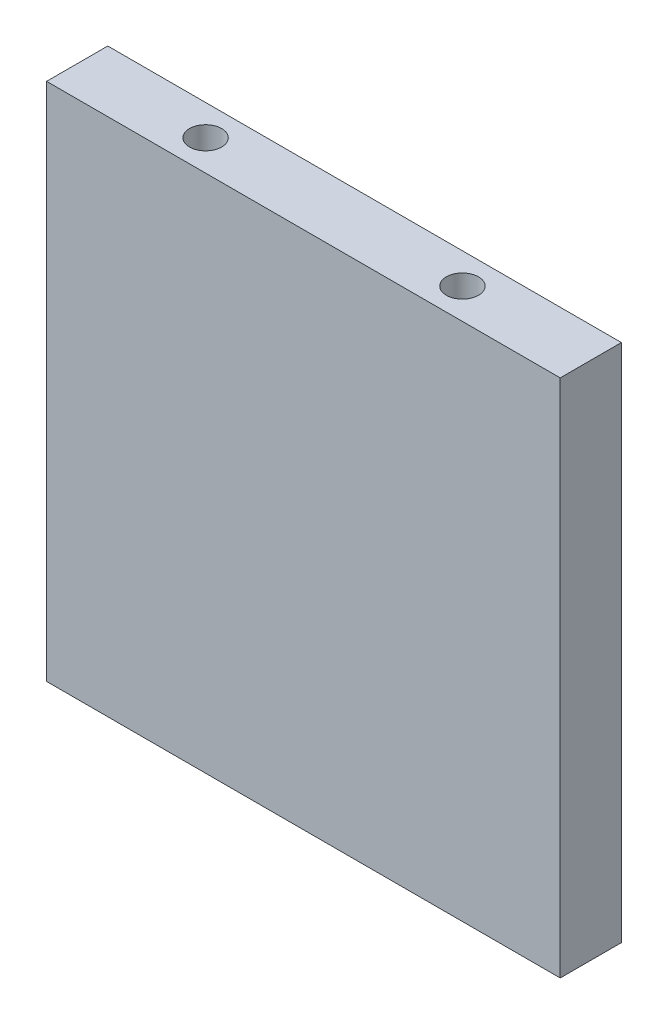
ISO-10303-21;
HEADER;
FILE_DESCRIPTION(('STEP AP214'),'2;1');
FILE_NAME('part.step','',(''),(''),'','','');
FILE_SCHEMA(('AUTOMOTIVE_DESIGN { 1 0 10303 214 1 1 1 1 }'));
ENDSEC;
DATA;
#1=APPLICATION_CONTEXT('core data for automotive mechanical design processes');
#2=APPLICATION_PROTOCOL_DEFINITION('international standard','automotive_design',2000,#1);
#3=PRODUCT_CONTEXT('',#1,'mechanical');
#4=PRODUCT('Part','Part','',(#3));
#5=PRODUCT_RELATED_PRODUCT_CATEGORY('part','',(#4));
#6=PRODUCT_DEFINITION_FORMATION('','',#4);
#7=PRODUCT_DEFINITION_CONTEXT('part definition',#1,'design');
#8=PRODUCT_DEFINITION('design','',#6,#7);
#9=PRODUCT_DEFINITION_SHAPE('','',#8);
#10=(LENGTH_UNIT() NAMED_UNIT(*) SI_UNIT(.MILLI.,.METRE.));
#11=(NAMED_UNIT(*) PLANE_ANGLE_UNIT() SI_UNIT($,.RADIAN.));
#12=(NAMED_UNIT(*) SI_UNIT($,.STERADIAN.) SOLID_ANGLE_UNIT());
#13=UNCERTAINTY_MEASURE_WITH_UNIT(LENGTH_MEASURE(1.E-05),#10,'distance_accuracy_value','');
#14=(GEOMETRIC_REPRESENTATION_CONTEXT(3) GLOBAL_UNCERTAINTY_ASSIGNED_CONTEXT((#13)) GLOBAL_UNIT_ASSIGNED_CONTEXT((#10,
#11,#12)) REPRESENTATION_CONTEXT('',''));
#15=CARTESIAN_POINT('',(0.,0.,0.));
#16=DIRECTION('',(0.,0.,1.));
#17=DIRECTION('',(1.,0.,0.));
#18=AXIS2_PLACEMENT_3D('',#15,#16,#17);
#19=CARTESIAN_POINT('',(-40.,40.475,9.53));
#20=DIRECTION('',(1.,0.,0.));
#21=DIRECTION('',(0.,1.,0.));
#22=AXIS2_PLACEMENT_3D('',#19,#20,#21);
#23=PLANE('',#22);
#24=DIRECTION('',(0.,-1.,0.));
#25=VECTOR('',#24,1.);
#26=CARTESIAN_POINT('',(-40.,40.475,0.));
#27=LINE('',#26,#25);
#28=CARTESIAN_POINT('',(-40.,40.475,0.));
#29=VERTEX_POINT('',#28);
#30=CARTESIAN_POINT('',(-40.,-40.475,0.));
#31=VERTEX_POINT('',#30);
#32=EDGE_CURVE('E106',#29,#31,#27,.T.);
#33=ORIENTED_EDGE('',*,*,#32,.T.);
#34=DIRECTION('',(0.,0.,-1.));
#35=VECTOR('',#34,1.);
#36=CARTESIAN_POINT('',(-40.,-40.475,9.53));
#37=LINE('',#36,#35);
#38=CARTESIAN_POINT('',(-40.,-40.475,9.53));
#39=VERTEX_POINT('',#38);
#40=EDGE_CURVE('E13',#39,#31,#37,.T.);
#41=ORIENTED_EDGE('',*,*,#40,.F.);
#42=DIRECTION('',(0.,-1.,0.));
#43=VECTOR('',#42,1.);
#44=CARTESIAN_POINT('',(-40.,40.475,9.53));
#45=LINE('',#44,#43);
#46=CARTESIAN_POINT('',(-40.,40.475,9.53));
#47=VERTEX_POINT('',#46);
#48=EDGE_CURVE('E94',#47,#39,#45,.T.);
#49=ORIENTED_EDGE('',*,*,#48,.F.);
#50=DIRECTION('',(0.,0.,-1.));
#51=VECTOR('',#50,1.);
#52=CARTESIAN_POINT('',(-40.,40.475,9.53));
#53=LINE('',#52,#51);
#54=EDGE_CURVE('E102',#47,#29,#53,.T.);
#55=ORIENTED_EDGE('',*,*,#54,.T.);
#56=EDGE_LOOP('',(#33,#41,#49,#55));
#57=FACE_BOUND('',#56,.T.);
#58=ADVANCED_FACE('F43',(#57),#23,.F.);
#59=CARTESIAN_POINT('',(-40.,-40.475,9.53));
#60=DIRECTION('',(0.,1.,0.));
#61=DIRECTION('',(0.,0.,1.));
#62=AXIS2_PLACEMENT_3D('',#59,#60,#61);
#63=PLANE('',#62);
#64=CARTESIAN_POINT('',(20.,-40.475,5.));
#65=DIRECTION('',(0.,-1.,0.));
#66=DIRECTION('',(0.,0.,1.));
#67=AXIS2_PLACEMENT_3D('',#64,#65,#66);
#68=CIRCLE('',#67,2.5);
#69=CARTESIAN_POINT('',(20.,-40.475,7.5));
#70=VERTEX_POINT('',#69);
#71=EDGE_CURVE('E138',#70,#70,#68,.T.);
#72=ORIENTED_EDGE('',*,*,#71,.F.);
#73=EDGE_LOOP('',(#72));
#74=FACE_BOUND('',#73,.T.);
#75=CARTESIAN_POINT('',(-20.,-40.475,4.7625));
#76=DIRECTION('',(0.,-1.,0.));
#77=DIRECTION('',(0.,0.,-1.));
#78=AXIS2_PLACEMENT_3D('',#75,#76,#77);
#79=CIRCLE('',#78,2.49999999999999);
#80=CARTESIAN_POINT('',(-20.,-40.475,2.26250000000001));
#81=VERTEX_POINT('',#80);
#82=EDGE_CURVE('E132',#81,#81,#79,.T.);
#83=ORIENTED_EDGE('',*,*,#82,.F.);
#84=EDGE_LOOP('',(#83));
#85=FACE_BOUND('',#84,.T.);
#86=DIRECTION('',(1.,0.,0.));
#87=VECTOR('',#86,1.);
#88=CARTESIAN_POINT('',(-40.,-40.475,0.));
#89=LINE('',#88,#87);
#90=CARTESIAN_POINT('',(40.,-40.475,0.));
#91=VERTEX_POINT('',#90);
#92=EDGE_CURVE('E98',#31,#91,#89,.T.);
#93=ORIENTED_EDGE('',*,*,#92,.T.);
#94=DIRECTION('',(0.,0.,-1.));
#95=VECTOR('',#94,1.);
#96=CARTESIAN_POINT('',(40.,-40.475,9.53));
#97=LINE('',#96,#95);
#98=CARTESIAN_POINT('',(40.,-40.475,9.53));
#99=VERTEX_POINT('',#98);
#100=EDGE_CURVE('E51',#99,#91,#97,.T.);
#101=ORIENTED_EDGE('',*,*,#100,.F.);
#102=DIRECTION('',(1.,0.,0.));
#103=VECTOR('',#102,1.);
#104=CARTESIAN_POINT('',(-40.,-40.475,9.53));
#105=LINE('',#104,#103);
#106=EDGE_CURVE('E89',#39,#99,#105,.T.);
#107=ORIENTED_EDGE('',*,*,#106,.F.);
#108=ORIENTED_EDGE('',*,*,#40,.T.);
#109=EDGE_LOOP('',(#93,#101,#107,#108));
#110=FACE_BOUND('',#109,.T.);
#111=ADVANCED_FACE('F97',(#74,#85,#110),#63,.F.);
#112=CARTESIAN_POINT('',(40.,40.475,9.53));
#113=DIRECTION('',(-1.,0.,0.));
#114=DIRECTION('',(0.,-1.,0.));
#115=AXIS2_PLACEMENT_3D('',#112,#113,#114);
#116=PLANE('',#115);
#117=DIRECTION('',(0.,1.,0.));
#118=VECTOR('',#117,1.);
#119=CARTESIAN_POINT('',(40.,40.475,0.));
#120=LINE('',#119,#118);
#121=CARTESIAN_POINT('',(40.,40.475,0.));
#122=VERTEX_POINT('',#121);
#123=EDGE_CURVE('E76',#91,#122,#120,.T.);
#124=ORIENTED_EDGE('',*,*,#123,.T.);
#125=DIRECTION('',(0.,0.,-1.));
#126=VECTOR('',#125,1.);
#127=CARTESIAN_POINT('',(40.,40.475,9.53));
#128=LINE('',#127,#126);
#129=CARTESIAN_POINT('',(40.,40.475,9.53));
#130=VERTEX_POINT('',#129);
#131=EDGE_CURVE('E99',#130,#122,#128,.T.);
#132=ORIENTED_EDGE('',*,*,#131,.F.);
#133=DIRECTION('',(0.,1.,0.));
#134=VECTOR('',#133,1.);
#135=CARTESIAN_POINT('',(40.,40.475,9.53));
#136=LINE('',#135,#134);
#137=EDGE_CURVE('E92',#99,#130,#136,.T.);
#138=ORIENTED_EDGE('',*,*,#137,.F.);
#139=ORIENTED_EDGE('',*,*,#100,.T.);
#140=EDGE_LOOP('',(#124,#132,#138,#139));
#141=FACE_BOUND('',#140,.T.);
#142=ADVANCED_FACE('F100',(#141),#116,.F.);
#143=CARTESIAN_POINT('',(-40.,40.475,9.53));
#144=DIRECTION('',(0.,-1.,0.));
#145=DIRECTION('',(0.,0.,-1.));
#146=AXIS2_PLACEMENT_3D('',#143,#144,#145);
#147=PLANE('',#146);
#148=CARTESIAN_POINT('',(19.9999999999999,40.475,4.76250000000005));
#149=DIRECTION('',(0.,1.,0.));
#150=DIRECTION('',(0.,0.,-1.));
#151=AXIS2_PLACEMENT_3D('',#148,#149,#150);
#152=CIRCLE('',#151,2.5);
#153=CARTESIAN_POINT('',(19.9999999999999,40.475,2.26250000000005));
#154=VERTEX_POINT('',#153);
#155=EDGE_CURVE('E126',#154,#154,#152,.T.);
#156=ORIENTED_EDGE('',*,*,#155,.F.);
#157=EDGE_LOOP('',(#156));
#158=FACE_BOUND('',#157,.T.);
#159=CARTESIAN_POINT('',(-20.,40.475,4.7625));
#160=DIRECTION('',(0.,1.,0.));
#161=DIRECTION('',(0.,0.,1.));
#162=AXIS2_PLACEMENT_3D('',#159,#160,#161);
#163=CIRCLE('',#162,2.5);
#164=CARTESIAN_POINT('',(-20.,40.475,7.2625));
#165=VERTEX_POINT('',#164);
#166=EDGE_CURVE('E120',#165,#165,#163,.T.);
#167=ORIENTED_EDGE('',*,*,#166,.F.);
#168=EDGE_LOOP('',(#167));
#169=FACE_BOUND('',#168,.T.);
#170=DIRECTION('',(-1.,0.,0.));
#171=VECTOR('',#170,1.);
#172=CARTESIAN_POINT('',(-40.,40.475,0.));
#173=LINE('',#172,#171);
#174=EDGE_CURVE('E82',#122,#29,#173,.T.);
#175=ORIENTED_EDGE('',*,*,#174,.T.);
#176=ORIENTED_EDGE('',*,*,#54,.F.);
#177=DIRECTION('',(-1.,0.,0.));
#178=VECTOR('',#177,1.);
#179=CARTESIAN_POINT('',(-40.,40.475,9.53));
#180=LINE('',#179,#178);
#181=EDGE_CURVE('E59',#130,#47,#180,.T.);
#182=ORIENTED_EDGE('',*,*,#181,.F.);
#183=ORIENTED_EDGE('',*,*,#131,.T.);
#184=EDGE_LOOP('',(#175,#176,#182,#183));
#185=FACE_BOUND('',#184,.T.);
#186=ADVANCED_FACE('F114',(#158,#169,#185),#147,.F.);
#187=CARTESIAN_POINT('',(-40.,-40.475,9.53));
#188=DIRECTION('',(0.,0.,1.));
#189=DIRECTION('',(1.,0.,0.));
#190=AXIS2_PLACEMENT_3D('',#187,#188,#189);
#191=PLANE('',#190);
#192=ORIENTED_EDGE('',*,*,#48,.T.);
#193=ORIENTED_EDGE('',*,*,#106,.T.);
#194=ORIENTED_EDGE('',*,*,#137,.T.);
#195=ORIENTED_EDGE('',*,*,#181,.T.);
#196=EDGE_LOOP('',(#192,#193,#194,#195));
#197=FACE_BOUND('',#196,.T.);
#198=ADVANCED_FACE('F90',(#197),#191,.T.);
#199=CARTESIAN_POINT('',(-40.,-40.475,0.));
#200=DIRECTION('',(0.,0.,1.));
#201=DIRECTION('',(1.,0.,0.));
#202=AXIS2_PLACEMENT_3D('',#199,#200,#201);
#203=PLANE('',#202);
#204=ORIENTED_EDGE('',*,*,#32,.F.);
#205=ORIENTED_EDGE('',*,*,#174,.F.);
#206=ORIENTED_EDGE('',*,*,#123,.F.);
#207=ORIENTED_EDGE('',*,*,#92,.F.);
#208=EDGE_LOOP('',(#204,#205,#206,#207));
#209=FACE_BOUND('',#208,.T.);
#210=ADVANCED_FACE('F117',(#209),#203,.F.);
#211=CARTESIAN_POINT('',(-20.,20.475,4.7625));
#212=DIRECTION('',(0.,1.,0.));
#213=DIRECTION('',(0.,0.,1.));
#214=AXIS2_PLACEMENT_3D('',#211,#212,#213);
#215=CYLINDRICAL_SURFACE('',#214,2.5);
#216=CARTESIAN_POINT('',(-20.,20.475,4.7625));
#217=DIRECTION('',(0.,1.,0.));
#218=DIRECTION('',(0.,0.,1.));
#219=AXIS2_PLACEMENT_3D('',#216,#217,#218);
#220=CIRCLE('',#219,2.5);
#221=CARTESIAN_POINT('',(-20.,20.475,7.2625));
#222=VERTEX_POINT('',#221);
#223=EDGE_CURVE('E109',#222,#222,#220,.T.);
#224=ORIENTED_EDGE('',*,*,#223,.F.);
#225=EDGE_LOOP('',(#224));
#226=FACE_BOUND('',#225,.T.);
#227=ORIENTED_EDGE('',*,*,#166,.T.);
#228=EDGE_LOOP('',(#227));
#229=FACE_BOUND('',#228,.T.);
#230=ADVANCED_FACE('F206',(#226,#229),#215,.F.);
#231=CARTESIAN_POINT('',(-20.,20.475,4.7625));
#232=DIRECTION('',(0.,1.,0.));
#233=DIRECTION('',(0.,0.,1.));
#234=AXIS2_PLACEMENT_3D('',#231,#232,#233);
#235=PLANE('',#234);
#236=ORIENTED_EDGE('',*,*,#223,.T.);
#237=EDGE_LOOP('',(#236));
#238=FACE_BOUND('',#237,.T.);
#239=ADVANCED_FACE('F212',(#238),#235,.T.);
#240=CARTESIAN_POINT('',(19.9999999999999,20.475,4.76250000000005));
#241=DIRECTION('',(0.,1.,0.));
#242=DIRECTION('',(0.,0.,1.));
#243=AXIS2_PLACEMENT_3D('',#240,#241,#242);
#244=CYLINDRICAL_SURFACE('',#243,2.5);
#245=CARTESIAN_POINT('',(19.9999999999999,20.475,4.76250000000005));
#246=DIRECTION('',(0.,1.,0.));
#247=DIRECTION('',(0.,0.,-1.));
#248=AXIS2_PLACEMENT_3D('',#245,#246,#247);
#249=CIRCLE('',#248,2.5);
#250=CARTESIAN_POINT('',(19.9999999999999,20.475,2.26250000000005));
#251=VERTEX_POINT('',#250);
#252=EDGE_CURVE('E123',#251,#251,#249,.T.);
#253=ORIENTED_EDGE('',*,*,#252,.F.);
#254=EDGE_LOOP('',(#253));
#255=FACE_BOUND('',#254,.T.);
#256=ORIENTED_EDGE('',*,*,#155,.T.);
#257=EDGE_LOOP('',(#256));
#258=FACE_BOUND('',#257,.T.);
#259=ADVANCED_FACE('F168',(#255,#258),#244,.F.);
#260=CARTESIAN_POINT('',(19.9999999999999,20.475,4.76250000000005));
#261=DIRECTION('',(0.,-1.,0.));
#262=DIRECTION('',(0.,0.,-1.));
#263=AXIS2_PLACEMENT_3D('',#260,#261,#262);
#264=PLANE('',#263);
#265=ORIENTED_EDGE('',*,*,#252,.T.);
#266=EDGE_LOOP('',(#265));
#267=FACE_BOUND('',#266,.T.);
#268=ADVANCED_FACE('F159',(#267),#264,.F.);
#269=CARTESIAN_POINT('',(-20.,-20.475,4.7625));
#270=DIRECTION('',(0.,-1.,0.));
#271=DIRECTION('',(0.,0.,-1.));
#272=AXIS2_PLACEMENT_3D('',#269,#270,#271);
#273=CYLINDRICAL_SURFACE('',#272,2.49999999999999);
#274=CARTESIAN_POINT('',(-20.,-20.475,4.7625));
#275=DIRECTION('',(0.,-1.,0.));
#276=DIRECTION('',(0.,0.,-1.));
#277=AXIS2_PLACEMENT_3D('',#274,#275,#276);
#278=CIRCLE('',#277,2.49999999999999);
#279=CARTESIAN_POINT('',(-20.,-20.475,2.26250000000001));
#280=VERTEX_POINT('',#279);
#281=EDGE_CURVE('E129',#280,#280,#278,.T.);
#282=ORIENTED_EDGE('',*,*,#281,.F.);
#283=EDGE_LOOP('',(#282));
#284=FACE_BOUND('',#283,.T.);
#285=ORIENTED_EDGE('',*,*,#82,.T.);
#286=EDGE_LOOP('',(#285));
#287=FACE_BOUND('',#286,.T.);
#288=ADVANCED_FACE('F157',(#284,#287),#273,.F.);
#289=CARTESIAN_POINT('',(-20.,-20.475,4.7625));
#290=DIRECTION('',(0.,-1.,0.));
#291=DIRECTION('',(0.,0.,-1.));
#292=AXIS2_PLACEMENT_3D('',#289,#290,#291);
#293=PLANE('',#292);
#294=ORIENTED_EDGE('',*,*,#281,.T.);
#295=EDGE_LOOP('',(#294));
#296=FACE_BOUND('',#295,.T.);
#297=ADVANCED_FACE('F149',(#296),#293,.T.);
#298=CARTESIAN_POINT('',(20.,-20.475,5.));
#299=DIRECTION('',(0.,-1.,0.));
#300=DIRECTION('',(0.,0.,-1.));
#301=AXIS2_PLACEMENT_3D('',#298,#299,#300);
#302=CYLINDRICAL_SURFACE('',#301,2.5);
#303=CARTESIAN_POINT('',(20.,-20.475,5.));
#304=DIRECTION('',(0.,-1.,0.));
#305=DIRECTION('',(0.,0.,1.));
#306=AXIS2_PLACEMENT_3D('',#303,#304,#305);
#307=CIRCLE('',#306,2.5);
#308=CARTESIAN_POINT('',(20.,-20.475,7.5));
#309=VERTEX_POINT('',#308);
#310=EDGE_CURVE('E135',#309,#309,#307,.T.);
#311=ORIENTED_EDGE('',*,*,#310,.F.);
#312=EDGE_LOOP('',(#311));
#313=FACE_BOUND('',#312,.T.);
#314=ORIENTED_EDGE('',*,*,#71,.T.);
#315=EDGE_LOOP('',(#314));
#316=FACE_BOUND('',#315,.T.);
#317=ADVANCED_FACE('F146',(#313,#316),#302,.F.);
#318=CARTESIAN_POINT('',(20.,-20.475,5.));
#319=DIRECTION('',(0.,1.,0.));
#320=DIRECTION('',(0.,0.,1.));
#321=AXIS2_PLACEMENT_3D('',#318,#319,#320);
#322=PLANE('',#321);
#323=ORIENTED_EDGE('',*,*,#310,.T.);
#324=EDGE_LOOP('',(#323));
#325=FACE_BOUND('',#324,.T.);
#326=ADVANCED_FACE('F144',(#325),#322,.F.);
#327=CLOSED_SHELL('',(#58,#111,#142,#186,#198,#210,#230,#239,#259,#268,#288,#297,#317,#326));
#328=MANIFOLD_SOLID_BREP('B2',#327);
#329=ADVANCED_BREP_SHAPE_REPRESENTATION('',(#18,#328),#14);
#330=SHAPE_DEFINITION_REPRESENTATION(#9,#329);
ENDSEC;
END-ISO-10303-21;
